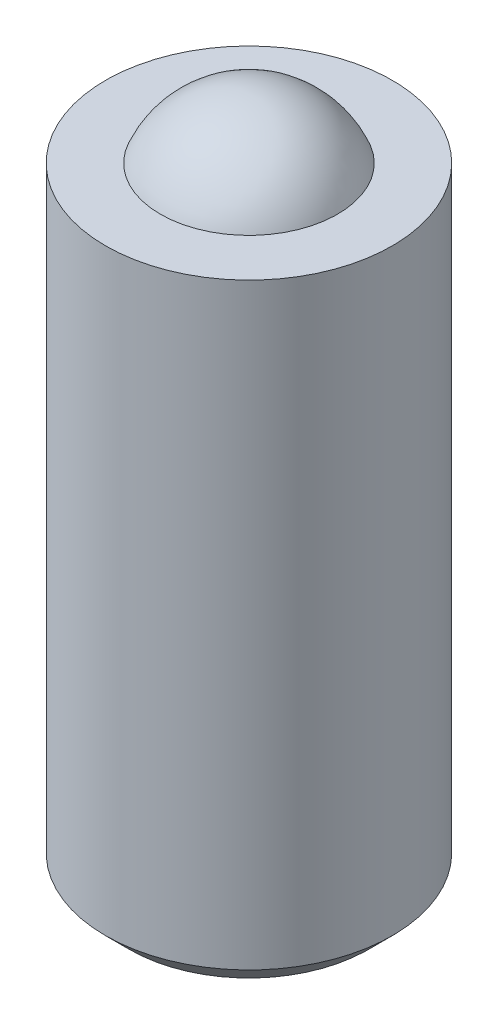
ISO-10303-21;
HEADER;
FILE_DESCRIPTION(('STEP AP214'),'2;1');
FILE_NAME('part.step','',(''),(''),'','','');
FILE_SCHEMA(('AUTOMOTIVE_DESIGN { 1 0 10303 214 1 1 1 1 }'));
ENDSEC;
DATA;
#1=APPLICATION_CONTEXT('core data for automotive mechanical design processes');
#2=APPLICATION_PROTOCOL_DEFINITION('international standard','automotive_design',2000,#1);
#3=PRODUCT_CONTEXT('',#1,'mechanical');
#4=PRODUCT('Part','Part','',(#3));
#5=PRODUCT_RELATED_PRODUCT_CATEGORY('part','',(#4));
#6=PRODUCT_DEFINITION_FORMATION('','',#4);
#7=PRODUCT_DEFINITION_CONTEXT('part definition',#1,'design');
#8=PRODUCT_DEFINITION('design','',#6,#7);
#9=PRODUCT_DEFINITION_SHAPE('','',#8);
#10=(LENGTH_UNIT() NAMED_UNIT(*) SI_UNIT(.MILLI.,.METRE.));
#11=(NAMED_UNIT(*) PLANE_ANGLE_UNIT() SI_UNIT($,.RADIAN.));
#12=(NAMED_UNIT(*) SI_UNIT($,.STERADIAN.) SOLID_ANGLE_UNIT());
#13=UNCERTAINTY_MEASURE_WITH_UNIT(LENGTH_MEASURE(1.E-05),#10,'distance_accuracy_value','');
#14=(GEOMETRIC_REPRESENTATION_CONTEXT(3) GLOBAL_UNCERTAINTY_ASSIGNED_CONTEXT((#13)) GLOBAL_UNIT_ASSIGNED_CONTEXT((#10,
#11,#12)) REPRESENTATION_CONTEXT('',''));
#15=CARTESIAN_POINT('',(0.,0.,0.));
#16=DIRECTION('',(0.,0.,1.));
#17=DIRECTION('',(1.,0.,0.));
#18=AXIS2_PLACEMENT_3D('',#15,#16,#17);
#19=CARTESIAN_POINT('',(0.,-1.5,0.));
#20=DIRECTION('',(0.,1.,0.));
#21=DIRECTION('',(0.,0.,1.));
#22=AXIS2_PLACEMENT_3D('',#19,#20,#21);
#23=SPHERICAL_SURFACE('',#22,4.);
#24=CARTESIAN_POINT('',(0.,0.,0.));
#25=DIRECTION('',(0.,1.,0.));
#26=DIRECTION('',(0.,0.,1.));
#27=AXIS2_PLACEMENT_3D('',#24,#25,#26);
#28=CIRCLE('',#27,3.70809924354783);
#29=CARTESIAN_POINT('',(0.,0.,3.70809924354783));
#30=VERTEX_POINT('',#29);
#31=EDGE_CURVE('E10',#30,#30,#28,.T.);
#32=ORIENTED_EDGE('',*,*,#31,.T.);
#33=EDGE_LOOP('',(#32));
#34=FACE_BOUND('',#33,.T.);
#35=ADVANCED_FACE('F33',(#34),#23,.T.);
#36=CARTESIAN_POINT('',(0.,0.,3.70809924354783));
#37=DIRECTION('',(0.,1.,0.));
#38=DIRECTION('',(0.,0.,1.));
#39=AXIS2_PLACEMENT_3D('',#36,#37,#38);
#40=PLANE('',#39);
#41=CARTESIAN_POINT('',(0.,0.,0.));
#42=DIRECTION('',(0.,1.,0.));
#43=DIRECTION('',(0.,0.,1.));
#44=AXIS2_PLACEMENT_3D('',#41,#42,#43);
#45=CIRCLE('',#44,5.99999999999999);
#46=CARTESIAN_POINT('',(0.,0.,5.99999999999999));
#47=VERTEX_POINT('',#46);
#48=EDGE_CURVE('E39',#47,#47,#45,.T.);
#49=ORIENTED_EDGE('',*,*,#48,.T.);
#50=EDGE_LOOP('',(#49));
#51=FACE_BOUND('',#50,.T.);
#52=ORIENTED_EDGE('',*,*,#31,.F.);
#53=EDGE_LOOP('',(#52));
#54=FACE_BOUND('',#53,.T.);
#55=ADVANCED_FACE('F65',(#51,#54),#40,.T.);
#56=CARTESIAN_POINT('',(0.,46.2984024863754,0.));
#57=DIRECTION('',(0.,1.,0.));
#58=DIRECTION('',(0.,0.,1.));
#59=AXIS2_PLACEMENT_3D('',#56,#57,#58);
#60=CYLINDRICAL_SURFACE('',#59,5.99999999999999);
#61=CARTESIAN_POINT('',(0.,-25.,0.));
#62=DIRECTION('',(0.,1.,0.));
#63=DIRECTION('',(0.,0.,1.));
#64=AXIS2_PLACEMENT_3D('',#61,#62,#63);
#65=CIRCLE('',#64,5.99999999999998);
#66=CARTESIAN_POINT('',(0.,-25.,5.99999999999998));
#67=VERTEX_POINT('',#66);
#68=EDGE_CURVE('E43',#67,#67,#65,.T.);
#69=ORIENTED_EDGE('',*,*,#68,.T.);
#70=EDGE_LOOP('',(#69));
#71=FACE_BOUND('',#70,.T.);
#72=ORIENTED_EDGE('',*,*,#48,.F.);
#73=EDGE_LOOP('',(#72));
#74=FACE_BOUND('',#73,.T.);
#75=ADVANCED_FACE('F62',(#71,#74),#60,.T.);
#76=CARTESIAN_POINT('',(0.,-25.,0.));
#77=DIRECTION('',(0.,1.,0.));
#78=DIRECTION('',(0.,0.,1.));
#79=AXIS2_PLACEMENT_3D('',#76,#77,#78);
#80=CONICAL_SURFACE('',#79,5.99999999999998,0.785398163397444);
#81=CARTESIAN_POINT('',(0.,-26.,0.));
#82=DIRECTION('',(0.,1.,0.));
#83=DIRECTION('',(0.,0.,1.));
#84=AXIS2_PLACEMENT_3D('',#81,#82,#83);
#85=CIRCLE('',#84,4.99999999999999);
#86=CARTESIAN_POINT('',(0.,-26.,4.99999999999999));
#87=VERTEX_POINT('',#86);
#88=EDGE_CURVE('E47',#87,#87,#85,.T.);
#89=ORIENTED_EDGE('',*,*,#88,.T.);
#90=EDGE_LOOP('',(#89));
#91=FACE_BOUND('',#90,.T.);
#92=ORIENTED_EDGE('',*,*,#68,.F.);
#93=EDGE_LOOP('',(#92));
#94=FACE_BOUND('',#93,.T.);
#95=ADVANCED_FACE('F53',(#91,#94),#80,.T.);
#96=CARTESIAN_POINT('',(0.,-26.,4.99999999999999));
#97=DIRECTION('',(0.,-1.,0.));
#98=DIRECTION('',(0.,0.,-1.));
#99=AXIS2_PLACEMENT_3D('',#96,#97,#98);
#100=PLANE('',#99);
#101=ORIENTED_EDGE('',*,*,#88,.F.);
#102=EDGE_LOOP('',(#101));
#103=FACE_BOUND('',#102,.T.);
#104=ADVANCED_FACE('F56',(#103),#100,.T.);
#105=CLOSED_SHELL('',(#35,#55,#75,#95,#104));
#106=MANIFOLD_SOLID_BREP('B2',#105);
#107=ADVANCED_BREP_SHAPE_REPRESENTATION('',(#18,#106),#14);
#108=SHAPE_DEFINITION_REPRESENTATION(#9,#107);
ENDSEC;
END-ISO-10303-21;
